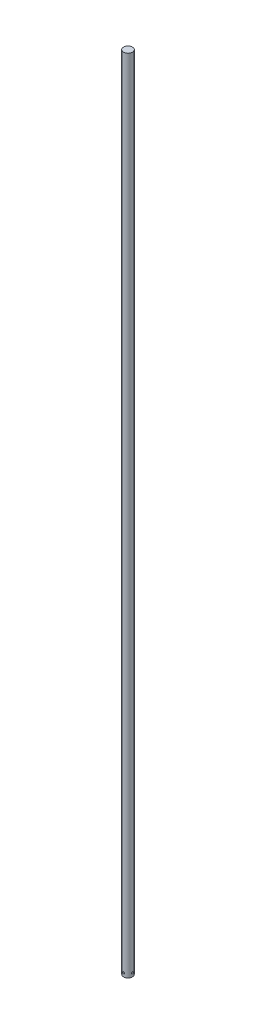
ISO-10303-21;
HEADER;
FILE_DESCRIPTION(('STEP AP214'),'2;1');
FILE_NAME('part.step','',(''),(''),'','','');
FILE_SCHEMA(('AUTOMOTIVE_DESIGN { 1 0 10303 214 1 1 1 1 }'));
ENDSEC;
DATA;
#1=APPLICATION_CONTEXT('core data for automotive mechanical design processes');
#2=APPLICATION_PROTOCOL_DEFINITION('international standard','automotive_design',2000,#1);
#3=PRODUCT_CONTEXT('',#1,'mechanical');
#4=PRODUCT('Part','Part','',(#3));
#5=PRODUCT_RELATED_PRODUCT_CATEGORY('part','',(#4));
#6=PRODUCT_DEFINITION_FORMATION('','',#4);
#7=PRODUCT_DEFINITION_CONTEXT('part definition',#1,'design');
#8=PRODUCT_DEFINITION('design','',#6,#7);
#9=PRODUCT_DEFINITION_SHAPE('','',#8);
#10=(LENGTH_UNIT() NAMED_UNIT(*) SI_UNIT(.MILLI.,.METRE.));
#11=(NAMED_UNIT(*) PLANE_ANGLE_UNIT() SI_UNIT($,.RADIAN.));
#12=(NAMED_UNIT(*) SI_UNIT($,.STERADIAN.) SOLID_ANGLE_UNIT());
#13=UNCERTAINTY_MEASURE_WITH_UNIT(LENGTH_MEASURE(1.E-05),#10,'distance_accuracy_value','');
#14=(GEOMETRIC_REPRESENTATION_CONTEXT(3) GLOBAL_UNCERTAINTY_ASSIGNED_CONTEXT((#13)) GLOBAL_UNIT_ASSIGNED_CONTEXT((#10,
#11,#12)) REPRESENTATION_CONTEXT('',''));
#15=CARTESIAN_POINT('',(0.,0.,0.));
#16=DIRECTION('',(0.,0.,1.));
#17=DIRECTION('',(1.,0.,0.));
#18=AXIS2_PLACEMENT_3D('',#15,#16,#17);
#19=CARTESIAN_POINT('',(0.,900.,0.));
#20=DIRECTION('',(0.,-1.,0.));
#21=DIRECTION('',(0.,0.,-1.));
#22=AXIS2_PLACEMENT_3D('',#19,#20,#21);
#23=CYLINDRICAL_SURFACE('',#22,5.);
#24=CARTESIAN_POINT('',(0.,5.,-5.));
#25=CARTESIAN_POINT('',(-0.055576906792633,4.99999795550166,-4.99999897580871));
#26=CARTESIAN_POINT('',(-0.111179660201522,4.99535115703235,-4.99906385178231));
#27=CARTESIAN_POINT('',(-0.220813507689019,4.97690149988475,-4.99542365623231));
#28=CARTESIAN_POINT('',(-0.274843317541355,4.96309136719849,-4.99271717860186));
#29=CARTESIAN_POINT('',(-0.379730305263311,4.92675872637921,-4.98583649278287));
#30=CARTESIAN_POINT('',(-0.430590467933132,4.9042445631553,-4.98166369076718));
#31=CARTESIAN_POINT('',(-0.527807988864223,4.8511677524887,-4.97230398035314));
#32=CARTESIAN_POINT('',(-0.574165615075808,4.82060558439279,-4.96711713235707));
#33=CARTESIAN_POINT('',(-0.661693477314861,4.75186150570855,-4.9562216532997));
#34=CARTESIAN_POINT('',(-0.702793951158519,4.71359164460879,-4.95050745504348));
#35=CARTESIAN_POINT('',(-0.778036756608022,4.63070758360828,-4.93924180452589));
#36=CARTESIAN_POINT('',(-0.812178544770417,4.58609288866487,-4.93369036500424));
#37=CARTESIAN_POINT('',(-0.872831753347612,4.49128380698811,-4.92332441812615));
#38=CARTESIAN_POINT('',(-0.899270938865857,4.44104235620363,-4.91851707364946));
#39=CARTESIAN_POINT('',(-0.943305666580297,4.3367181809959,-4.91026268058418));
#40=CARTESIAN_POINT('',(-0.960902082437225,4.28263583665364,-4.90681549761962));
#41=CARTESIAN_POINT('',(-0.986525299884813,4.17291563609207,-4.90172805252205));
#42=CARTESIAN_POINT('',(-0.994674497958762,4.11730745585776,-4.90006470107188));
#43=CARTESIAN_POINT('',(-1.0015521277261,4.00549017863564,-4.89866375060628));
#44=CARTESIAN_POINT('',(-1.00028152271348,3.94928114367984,-4.89892595467841));
#45=CARTESIAN_POINT('',(-0.988454573101799,3.83875321197898,-4.90132551148185));
#46=CARTESIAN_POINT('',(-0.978038540243884,3.78441859437267,-4.90343452858764));
#47=CARTESIAN_POINT('',(-0.948437884623028,3.67828392333698,-4.90924546160002));
#48=CARTESIAN_POINT('',(-0.929252843100657,3.62648399108098,-4.91294745357779));
#49=CARTESIAN_POINT('',(-0.882524783674695,3.52648473829639,-4.92155618500409));
#50=CARTESIAN_POINT('',(-0.854926151232088,3.47831212043081,-4.92647089813705));
#51=CARTESIAN_POINT('',(-0.792193574572651,3.38722915002717,-4.93694618773062));
#52=CARTESIAN_POINT('',(-0.7570587643568,3.34431940314883,-4.94250683838366));
#53=CARTESIAN_POINT('',(-0.679499934560554,3.26417059754305,-4.95377021241462));
#54=CARTESIAN_POINT('',(-0.636956161212414,3.22704743214086,-4.95947369210905));
#55=CARTESIAN_POINT('',(-0.546185024061978,3.16044615369877,-4.97028848714409));
#56=CARTESIAN_POINT('',(-0.497957587379357,3.13096813870641,-4.97539979488974));
#57=CARTESIAN_POINT('',(-0.397059386878887,3.08047249077402,-4.98446690160887));
#58=CARTESIAN_POINT('',(-0.344381819585266,3.05946810635546,-4.98842088848272));
#59=CARTESIAN_POINT('',(-0.23614897644863,3.02663952596143,-4.99471408987859));
#60=CARTESIAN_POINT('',(-0.180594050072415,3.01481421792637,-4.99705350000532));
#61=CARTESIAN_POINT('',(-0.0691794056271155,3.00084354620572,-4.99982671866868));
#62=CARTESIAN_POINT('',(-0.0133403283255413,2.99853958045973,-5.0002917465247));
#63=CARTESIAN_POINT('',(0.0979249341927487,3.00324985894218,-4.99935051930103));
#64=CARTESIAN_POINT('',(0.153351142443828,3.0102635793526,-4.99794436941446));
#65=CARTESIAN_POINT('',(0.261705659946574,3.03327837354396,-4.99343832008017));
#66=CARTESIAN_POINT('',(0.314651948339936,3.04919806849791,-4.99035376404206));
#67=CARTESIAN_POINT('',(0.4171236274997,3.08948398265582,-4.98283552061032));
#68=CARTESIAN_POINT('',(0.466648761637572,3.11385083467684,-4.97840173214226));
#69=CARTESIAN_POINT('',(0.561541173686249,3.17068249065132,-4.96859911533294));
#70=CARTESIAN_POINT('',(0.606850126752219,3.20324278103896,-4.96321950437051));
#71=CARTESIAN_POINT('',(0.691418019119237,3.27540919120729,-4.95214734829882));
#72=CARTESIAN_POINT('',(0.730676308930792,3.31501606639988,-4.94645476968387));
#73=CARTESIAN_POINT('',(0.802640590774204,3.40087335189114,-4.93529303556965));
#74=CARTESIAN_POINT('',(0.835237702448682,3.44721574422135,-4.92982860233304));
#75=CARTESIAN_POINT('',(0.892185420051231,3.54481136135669,-4.91984191796194));
#76=CARTESIAN_POINT('',(0.916536355922927,3.59606438957357,-4.91531962913342));
#77=CARTESIAN_POINT('',(0.956151841581983,3.70176824614957,-4.90776740584382));
#78=CARTESIAN_POINT('',(0.971463499791072,3.75620084121034,-4.90472974872186));
#79=CARTESIAN_POINT('',(0.992708651627215,3.86693345349092,-4.90047436792025));
#80=CARTESIAN_POINT('',(0.998643368225131,3.92323322620937,-4.89925640691111));
#81=CARTESIAN_POINT('',(1.00092091086748,4.03500886454434,-4.89879149631379));
#82=CARTESIAN_POINT('',(0.997435788070911,4.09048114892703,-4.89950919189301));
#83=CARTESIAN_POINT('',(0.981352304100074,4.20003164990504,-4.90275573484614));
#84=CARTESIAN_POINT('',(0.968754016129311,4.25410987769482,-4.90528456767169));
#85=CARTESIAN_POINT('',(0.934878568498965,4.35922771124056,-4.91185264219158));
#86=CARTESIAN_POINT('',(0.913622506717355,4.41027436050243,-4.9158882101883));
#87=CARTESIAN_POINT('',(0.863054644601613,4.50810372073445,-4.9250171497417));
#88=CARTESIAN_POINT('',(0.83374216877489,4.55488607372515,-4.93011060998894));
#89=CARTESIAN_POINT('',(0.767305914786421,4.64371557215033,-4.94088960523225));
#90=CARTESIAN_POINT('',(0.730057887235186,4.68566876526761,-4.94658372909699));
#91=CARTESIAN_POINT('',(0.649064369013145,4.76278620552918,-4.95786081871955));
#92=CARTESIAN_POINT('',(0.605317387153339,4.79794889031728,-4.96344375863184));
#93=CARTESIAN_POINT('',(0.512017629088249,4.86083464394646,-4.97393832387971));
#94=CARTESIAN_POINT('',(0.462408884429837,4.88847600328003,-4.97884231219246));
#95=CARTESIAN_POINT('',(0.359166360940734,4.9349861225966,-4.98735125085));
#96=CARTESIAN_POINT('',(0.305536260863127,4.9538627895325,-4.99095737138616));
#97=CARTESIAN_POINT('',(0.20982148892378,4.97865194804472,-4.99576372595371));
#98=CARTESIAN_POINT('',(0.168281664013785,4.98664319370776,-4.99734303158452));
#99=CARTESIAN_POINT('',(0.0844995252100672,4.99731791235837,-4.99946154139893));
#100=CARTESIAN_POINT('',(0.0422572337486191,5.00000155450977,-5.00000077873155));
#101=CARTESIAN_POINT('',(0.,5.,-5.));
#102=B_SPLINE_CURVE_WITH_KNOTS('',3,(#24,#25,#26,#27,#28,#29,#30,#31,#32,#33,#34,#35,#36,#37,
#38,#39,#40,#41,#42,#43,#44,#45,#46,#47,#48,#49,#50,#51,#52,#53,#54,#55,#56,#57,#58,#59,#60,#61,
#62,#63,#64,#65,#66,#67,#68,#69,#70,#71,#72,#73,#74,#75,#76,#77,#78,#79,#80,#81,#82,#83,#84,#85,
#86,#87,#88,#89,#90,#91,#92,#93,#94,#95,#96,#97,#98,#99,#100,#101),.UNSPECIFIED.,.T.,.F.,(4,2,2,
2,2,2,2,2,2,2,2,2,2,2,2,2,2,2,2,2,2,2,2,2,2,2,2,2,2,2,2,2,2,2,2,2,2,2,4),(0.,0.166576130661258,
0.333284650691323,0.499833735250342,0.666372902230863,0.834932670112186,1.00350559674737,
1.17361195005923,1.34370149365197,1.51156185103587,1.67940504281225,1.84471727006278,
2.0100373925373,2.17647490203593,2.3429315474967,2.51238252491351,2.6818356753982,
2.85155274854024,3.02124925698036,3.18810735676265,3.35495607657868,3.52030453950723,
3.68566539216022,3.85305066033359,4.0204538834593,4.19040628579226,4.36035188723466,
4.52940381032723,4.69843368330415,4.86439722567701,5.03035943492608,5.1959196125311,
5.36149367581866,5.52988076239143,5.6983065453293,5.86849496675637,6.03852955517519,
6.16518775289894,6.29184191370996),.UNSPECIFIED.);
#103=CARTESIAN_POINT('',(0.,5.,-5.));
#104=VERTEX_POINT('',#103);
#105=EDGE_CURVE('E91',#104,#104,#102,.T.);
#106=ORIENTED_EDGE('',*,*,#105,.T.);
#107=EDGE_LOOP('',(#106));
#108=FACE_BOUND('',#107,.T.);
#109=CARTESIAN_POINT('',(0.999999999999983,4.,4.89897948556636));
#110=CARTESIAN_POINT('',(0.999997945876028,3.94443562451802,4.89898059043933));
#111=CARTESIAN_POINT('',(0.995353171723639,3.88884537669351,4.89993508346913));
#112=CARTESIAN_POINT('',(0.976912283588318,3.77923749488159,4.90364431385263));
#113=CARTESIAN_POINT('',(0.963108847071164,3.72522115536893,4.90640049166333));
#114=CARTESIAN_POINT('',(0.926795782617721,3.62036269663707,4.91338873700356));
#115=CARTESIAN_POINT('',(0.904294814152065,3.56951747846507,4.91761933615313));
#116=CARTESIAN_POINT('',(0.851249107671026,3.47232515530538,4.92707799486421));
#117=CARTESIAN_POINT('',(0.820704818601279,3.42597779946273,4.93230599875015));
#118=CARTESIAN_POINT('',(0.751979075653272,3.3384389961455,4.9432529969268));
#119=CARTESIAN_POINT('',(0.713705655913262,3.29732041211586,4.94897737836825));
#120=CARTESIAN_POINT('',(0.630806789021332,3.22204246642119,4.9602247230302));
#121=CARTESIAN_POINT('',(0.586180896977978,3.18788359258285,4.96574767210945));
#122=CARTESIAN_POINT('',(0.491361355924228,3.12721198237149,4.97602796417448));
#123=CARTESIAN_POINT('',(0.44112256767219,3.10076848618335,4.9807782144152));
#124=CARTESIAN_POINT('',(0.336804150387257,3.05672506295188,4.98891736883662));
#125=CARTESIAN_POINT('',(0.282724881420536,3.03912430809901,4.99230640044128));
#126=CARTESIAN_POINT('',(0.173016773278476,3.01349280638037,4.99730320688411));
#127=CARTESIAN_POINT('',(0.117417739214797,3.00533902242899,4.99893386288125));
#128=CARTESIAN_POINT('',(0.00561856843751943,2.99844904816169,5.00030921183606));
#129=CARTESIAN_POINT('',(-0.0505815098318601,2.99971195035418,5.0000540865276));
#130=CARTESIAN_POINT('',(-0.161142000743606,3.01152618021555,4.99770434868515));
#131=CARTESIAN_POINT('',(-0.215517214298487,3.02194497716785,4.99563598365838));
#132=CARTESIAN_POINT('',(-0.321731626580318,3.05156503245889,4.98992177159409));
#133=CARTESIAN_POINT('',(-0.373570723747146,3.07076664219187,4.98627586144039));
#134=CARTESIAN_POINT('',(-0.473619463200904,3.11753004014727,4.97777296019958));
#135=CARTESIAN_POINT('',(-0.521804174133917,3.14514375110489,4.97290848175223));
#136=CARTESIAN_POINT('',(-0.612905045859773,3.2079090772366,4.96250469473785));
#137=CARTESIAN_POINT('',(-0.655820599525018,3.24306155977052,4.95696530855222));
#138=CARTESIAN_POINT('',(-0.735951431053474,3.32063362210847,4.94570964364459));
#139=CARTESIAN_POINT('',(-0.773054316573649,3.36316918672959,4.93999196457516));
#140=CARTESIAN_POINT('',(-0.839618493176824,3.45391644245075,4.9291157159876));
#141=CARTESIAN_POINT('',(-0.869079639727768,3.5021282408832,4.92395715704548));
#142=CARTESIAN_POINT('',(-0.919562814801898,3.60302083182181,4.91478047472923));
#143=CARTESIAN_POINT('',(-0.940566647777726,3.65571096763966,4.91076481563549));
#144=CARTESIAN_POINT('',(-0.973390341627599,3.76397132372399,4.90436476321273));
#145=CARTESIAN_POINT('',(-0.985211399456659,3.81954116761908,4.90198015728427));
#146=CARTESIAN_POINT('',(-0.999166006036068,3.93096485799904,4.89915479267827));
#147=CARTESIAN_POINT('',(-1.00146185889793,3.98679757431034,4.89868147057154));
#148=CARTESIAN_POINT('',(-0.996737628310756,4.09804822319968,4.89964485688854));
#149=CARTESIAN_POINT('',(-0.989718073122459,4.15346617911886,4.90108145700388));
#150=CARTESIAN_POINT('',(-0.966702208074174,4.26176864029224,4.90567232494914));
#151=CARTESIAN_POINT('',(-0.950792620839315,4.31467234303576,4.90880999014496));
#152=CARTESIAN_POINT('',(-0.910541035308534,4.41706327902874,4.91643489351665));
#153=CARTESIAN_POINT('',(-0.886198342373194,4.46655023043572,4.92092224286269));
#154=CARTESIAN_POINT('',(-0.829404142215615,4.56141310995016,4.93081405962039));
#155=CARTESIAN_POINT('',(-0.796851077982771,4.60672704630083,4.93622971864903));
#156=CARTESIAN_POINT('',(-0.72469557221273,4.69130831200092,4.94733723826636));
#157=CARTESIAN_POINT('',(-0.685092405144555,4.73057501824925,4.95302912723818));
#158=CARTESIAN_POINT('',(-0.599232273497908,4.80256255918558,4.96415345869215));
#159=CARTESIAN_POINT('',(-0.552882498929647,4.83517365465,4.96958057708684));
#160=CARTESIAN_POINT('',(-0.455267896634773,4.89214588149958,4.9794712762862));
#161=CARTESIAN_POINT('',(-0.404003275433524,4.91650735934478,4.98393489755211));
#162=CARTESIAN_POINT('',(-0.29830268082403,4.95612887174663,4.99137294061067));
#163=CARTESIAN_POINT('',(-0.243886673478095,4.97144051822625,4.99435579142604));
#164=CARTESIAN_POINT('',(-0.13318945467993,4.99269124766385,4.9985323593766));
#165=CARTESIAN_POINT('',(-0.0769084687112314,4.99863145947568,4.99972629199843));
#166=CARTESIAN_POINT('',(0.0348728939036059,5.00092698096289,5.00018540454121));
#167=CARTESIAN_POINT('',(0.0903698121414847,4.99744728045621,4.99948378549351));
#168=CARTESIAN_POINT('',(0.199971031315624,4.98136604945219,4.99630043560318));
#169=CARTESIAN_POINT('',(0.254075349753674,4.96876463365193,4.99381872714351));
#170=CARTESIAN_POINT('',(0.359252749745079,4.93487100790836,4.98735498365001));
#171=CARTESIAN_POINT('',(0.410332443240263,4.91359862186882,4.98337637247913));
#172=CARTESIAN_POINT('',(0.508221220185935,4.8629877586691,4.97434722123383));
#173=CARTESIAN_POINT('',(0.555029965767394,4.83364864409628,4.96929659645878));
#174=CARTESIAN_POINT('',(0.643863890106341,4.76718061293792,4.95857599157869));
#175=CARTESIAN_POINT('',(0.685799716116487,4.72993366361323,4.95289733422143));
#176=CARTESIAN_POINT('',(0.762882617756829,4.64894975990422,4.94161222903623));
#177=CARTESIAN_POINT('',(0.798028083202695,4.60521127053126,4.93600579862875));
#178=CARTESIAN_POINT('',(0.860892219455183,4.51192068329982,4.92543342749964));
#179=CARTESIAN_POINT('',(0.88852681463975,4.46231103883963,4.92047503631328));
#180=CARTESIAN_POINT('',(0.935024049287791,4.35906722670031,4.91185237184445));
#181=CARTESIAN_POINT('',(0.953894645979273,4.30543676130208,4.90818692536957));
#182=CARTESIAN_POINT('',(0.978669139854256,4.20973754456343,4.90329681128922));
#183=CARTESIAN_POINT('',(0.986653898522969,4.16821458048854,4.90168784915661));
#184=CARTESIAN_POINT('',(0.997320017960392,4.08446604544636,4.8995287845803));
#185=CARTESIAN_POINT('',(1.00000156156204,4.04224049875183,4.89897864563277));
#186=CARTESIAN_POINT('',(0.999999999999983,4.,4.89897948556636));
#187=B_SPLINE_CURVE_WITH_KNOTS('',3,(#109,#110,#111,#112,#113,#114,#115,#116,#117,#118,#119,
#120,#121,#122,#123,#124,#125,#126,#127,#128,#129,#130,#131,#132,#133,#134,#135,#136,#137,#138,
#139,#140,#141,#142,#143,#144,#145,#146,#147,#148,#149,#150,#151,#152,#153,#154,#155,#156,#157,
#158,#159,#160,#161,#162,#163,#164,#165,#166,#167,#168,#169,#170,#171,#172,#173,#174,#175,#176,
#177,#178,#179,#180,#181,#182,#183,#184,#185,#186),.UNSPECIFIED.,.T.,.F.,(4,2,2,2,2,2,2,2,2,2,2,
2,2,2,2,2,2,2,2,2,2,2,2,2,2,2,2,2,2,2,2,2,2,2,2,2,2,2,4),(0.,0.166538463856524,
0.333210239259264,0.499716497915554,0.666213464834831,0.834822525459335,1.00344340032919,
1.17353400434947,1.34360868244057,1.51144248880577,1.67926012113745,1.84468789631034,
2.01012229071247,2.176599242198,2.34309535767563,2.5124934675998,2.68189478120217,
2.85165863170273,3.02140035013522,3.1882375780209,3.35506534525918,3.52029341780816,
3.68553510351895,3.85293059772018,4.02034332867706,4.19032601730948,4.36030156627602,
4.52929813576147,4.69827434689125,4.86431017412183,5.03034391364254,5.19600017072949,
5.36166952132181,5.53001152023094,5.69839338887278,5.86858898576538,6.0386297508643,
6.16523803634393,6.29184195681712),.UNSPECIFIED.);
#188=CARTESIAN_POINT('',(0.999999999999983,4.,4.89897948556636));
#189=VERTEX_POINT('',#188);
#190=EDGE_CURVE('E87',#189,#189,#187,.T.);
#191=ORIENTED_EDGE('',*,*,#190,.T.);
#192=EDGE_LOOP('',(#191));
#193=FACE_BOUND('',#192,.T.);
#194=CARTESIAN_POINT('',(4.89897948556636,4.,1.));
#195=CARTESIAN_POINT('',(4.89898059043933,4.05556437548198,0.999997945876045));
#196=CARTESIAN_POINT('',(4.89993508346913,4.11115462330649,0.995353171723656));
#197=CARTESIAN_POINT('',(4.90364431385263,4.22076250511841,0.976912283588335));
#198=CARTESIAN_POINT('',(4.90640049166333,4.27477884463107,0.963108847071181));
#199=CARTESIAN_POINT('',(4.91338873700356,4.37963730336293,0.926795782617738));
#200=CARTESIAN_POINT('',(4.91761933615313,4.43048252153493,0.904294814152083));
#201=CARTESIAN_POINT('',(4.92707799486421,4.52767484469462,0.851249107671043));
#202=CARTESIAN_POINT('',(4.93230599875014,4.57402220053727,0.820704818601296));
#203=CARTESIAN_POINT('',(4.9432529969268,4.6615610038545,0.75197907565329));
#204=CARTESIAN_POINT('',(4.94897737836825,4.70267958788414,0.713705655913279));
#205=CARTESIAN_POINT('',(4.9602247230302,4.77795753357881,0.63080678902135));
#206=CARTESIAN_POINT('',(4.96574767210945,4.81211640741714,0.586180896977995));
#207=CARTESIAN_POINT('',(4.97602796417448,4.8727880176285,0.491361355924246));
#208=CARTESIAN_POINT('',(4.9807782144152,4.89923151381665,0.441122567672208));
#209=CARTESIAN_POINT('',(4.98891736883662,4.94327493704812,0.336804150387275));
#210=CARTESIAN_POINT('',(4.99230640044127,4.96087569190099,0.282724881420554));
#211=CARTESIAN_POINT('',(4.9973032068841,4.98650719361963,0.173016773278494));
#212=CARTESIAN_POINT('',(4.99893386288125,4.99466097757101,0.117417739214814));
#213=CARTESIAN_POINT('',(5.00030921183606,5.00155095183831,0.0056185684375371));
#214=CARTESIAN_POINT('',(5.0000540865276,5.00028804964582,-0.0505815098318425));
#215=CARTESIAN_POINT('',(4.99770434868515,4.98847381978445,-0.161142000743588));
#216=CARTESIAN_POINT('',(4.99563598365838,4.97805502283215,-0.21551721429847));
#217=CARTESIAN_POINT('',(4.98992177159409,4.94843496754111,-0.321731626580301));
#218=CARTESIAN_POINT('',(4.98627586144039,4.92923335780813,-0.373570723747128));
#219=CARTESIAN_POINT('',(4.97777296019958,4.88246995985273,-0.473619463200887));
#220=CARTESIAN_POINT('',(4.97290848175224,4.85485624889511,-0.521804174133899));
#221=CARTESIAN_POINT('',(4.96250469473785,4.7920909227634,-0.612905045859755));
#222=CARTESIAN_POINT('',(4.95696530855222,4.75693844022948,-0.655820599525));
#223=CARTESIAN_POINT('',(4.9457096436446,4.67936637789153,-0.735951431053457));
#224=CARTESIAN_POINT('',(4.93999196457516,4.63683081327041,-0.773054316573631));
#225=CARTESIAN_POINT('',(4.92911571598761,4.54608355754925,-0.839618493176807));
#226=CARTESIAN_POINT('',(4.92395715704548,4.4978717591168,-0.86907963972775));
#227=CARTESIAN_POINT('',(4.91478047472924,4.39697916817819,-0.919562814801881));
#228=CARTESIAN_POINT('',(4.91076481563549,4.34428903236034,-0.940566647777709));
#229=CARTESIAN_POINT('',(4.90436476321273,4.23602867627601,-0.973390341627582));
#230=CARTESIAN_POINT('',(4.90198015728428,4.18045883238092,-0.985211399456642));
#231=CARTESIAN_POINT('',(4.89915479267828,4.06903514200095,-0.999166006036051));
#232=CARTESIAN_POINT('',(4.89868147057154,4.01320242568966,-1.00146185889791));
#233=CARTESIAN_POINT('',(4.89964485688854,3.90195177680032,-0.996737628310738));
#234=CARTESIAN_POINT('',(4.90108145700388,3.84653382088114,-0.989718073122442));
#235=CARTESIAN_POINT('',(4.90567232494915,3.73823135970777,-0.966702208074157));
#236=CARTESIAN_POINT('',(4.90880999014497,3.68532765696424,-0.950792620839298));
#237=CARTESIAN_POINT('',(4.91643489351665,3.58293672097126,-0.910541035308518));
#238=CARTESIAN_POINT('',(4.9209222428627,3.53344976956428,-0.886198342373177));
#239=CARTESIAN_POINT('',(4.93081405962039,3.43858689004984,-0.829404142215598));
#240=CARTESIAN_POINT('',(4.93622971864903,3.39327295369917,-0.796851077982754));
#241=CARTESIAN_POINT('',(4.94733723826637,3.30869168799909,-0.724695572212713));
#242=CARTESIAN_POINT('',(4.95302912723818,3.26942498175075,-0.685092405144538));
#243=CARTESIAN_POINT('',(4.96415345869216,3.19743744081442,-0.599232273497891));
#244=CARTESIAN_POINT('',(4.96958057708684,3.16482634535,-0.55288249892963));
#245=CARTESIAN_POINT('',(4.9794712762862,3.10785411850042,-0.455267896634756));
#246=CARTESIAN_POINT('',(4.98393489755211,3.08349264065522,-0.404003275433507));
#247=CARTESIAN_POINT('',(4.99137294061067,3.04387112825337,-0.298302680824013));
#248=CARTESIAN_POINT('',(4.99435579142604,3.02855948177375,-0.243886673478078));
#249=CARTESIAN_POINT('',(4.9985323593766,3.00730875233615,-0.133189454679913));
#250=CARTESIAN_POINT('',(4.99972629199843,3.00136854052432,-0.0769084687112144));
#251=CARTESIAN_POINT('',(5.00018540454121,2.99907301903711,0.0348728939036229));
#252=CARTESIAN_POINT('',(4.99948378549351,3.00255271954379,0.090369812141502));
#253=CARTESIAN_POINT('',(4.99630043560318,3.01863395054781,0.199971031315641));
#254=CARTESIAN_POINT('',(4.99381872714351,3.03123536634807,0.254075349753691));
#255=CARTESIAN_POINT('',(4.98735498365001,3.06512899209164,0.359252749745096));
#256=CARTESIAN_POINT('',(4.98337637247912,3.08640137813118,0.41033244324028));
#257=CARTESIAN_POINT('',(4.97434722123382,3.1370122413309,0.508221220185952));
#258=CARTESIAN_POINT('',(4.96929659645878,3.16635135590372,0.555029965767411));
#259=CARTESIAN_POINT('',(4.95857599157869,3.23281938706208,0.643863890106357));
#260=CARTESIAN_POINT('',(4.95289733422142,3.27006633638677,0.685799716116503));
#261=CARTESIAN_POINT('',(4.94161222903622,3.35105024009577,0.762882617756845));
#262=CARTESIAN_POINT('',(4.93600579862875,3.39478872946874,0.798028083202712));
#263=CARTESIAN_POINT('',(4.92543342749964,3.48807931670018,0.8608922194552));
#264=CARTESIAN_POINT('',(4.92047503631328,3.53768896116036,0.888526814639766));
#265=CARTESIAN_POINT('',(4.91185237184445,3.64093277329969,0.935024049287808));
#266=CARTESIAN_POINT('',(4.90818692536957,3.69456323869792,0.95389464597929));
#267=CARTESIAN_POINT('',(4.90329681128922,3.79026245543657,0.978669139854273));
#268=CARTESIAN_POINT('',(4.90168784915661,3.83178541951145,0.986653898522985));
#269=CARTESIAN_POINT('',(4.8995287845803,3.91553395455364,0.997320017960409));
#270=CARTESIAN_POINT('',(4.89897864563277,3.95775950124817,1.00000156156205));
#271=CARTESIAN_POINT('',(4.89897948556636,4.,1.));
#272=B_SPLINE_CURVE_WITH_KNOTS('',3,(#194,#195,#196,#197,#198,#199,#200,#201,#202,#203,#204,
#205,#206,#207,#208,#209,#210,#211,#212,#213,#214,#215,#216,#217,#218,#219,#220,#221,#222,#223,
#224,#225,#226,#227,#228,#229,#230,#231,#232,#233,#234,#235,#236,#237,#238,#239,#240,#241,#242,
#243,#244,#245,#246,#247,#248,#249,#250,#251,#252,#253,#254,#255,#256,#257,#258,#259,#260,#261,
#262,#263,#264,#265,#266,#267,#268,#269,#270,#271),.UNSPECIFIED.,.T.,.F.,(4,2,2,2,2,2,2,2,2,2,2,
2,2,2,2,2,2,2,2,2,2,2,2,2,2,2,2,2,2,2,2,2,2,2,2,2,2,2,4),(0.,0.166538463856524,
0.333210239259264,0.499716497915553,0.666213464834831,0.834822525459334,1.00344340032919,
1.17353400434947,1.34360868244056,1.51144248880577,1.67926012113745,1.84468789631034,
2.01012229071247,2.176599242198,2.34309535767563,2.5124934675998,2.68189478120217,
2.85165863170273,3.02140035013522,3.1882375780209,3.35506534525918,3.52029341780816,
3.68553510351895,3.85293059772018,4.02034332867705,4.19032601730947,4.36030156627601,
4.52929813576147,4.69827434689125,4.86431017412183,5.03034391364253,5.19600017072949,
5.36166952132181,5.53001152023093,5.69839338887278,5.86858898576538,6.03862975086429,
6.16523803634392,6.29184195681711),.UNSPECIFIED.);
#273=CARTESIAN_POINT('',(4.89897948556636,4.,1.));
#274=VERTEX_POINT('',#273);
#275=EDGE_CURVE('E73',#274,#274,#272,.T.);
#276=ORIENTED_EDGE('',*,*,#275,.T.);
#277=EDGE_LOOP('',(#276));
#278=FACE_BOUND('',#277,.T.);
#279=CARTESIAN_POINT('',(-4.89897948556636,4.,-1.));
#280=CARTESIAN_POINT('',(-4.89898059043933,4.05556437548198,-0.999997945876045));
#281=CARTESIAN_POINT('',(-4.89993508346913,4.11115462330649,-0.995353171723656));
#282=CARTESIAN_POINT('',(-4.90364431385263,4.22076250511841,-0.976912283588335));
#283=CARTESIAN_POINT('',(-4.90640049166333,4.27477884463107,-0.963108847071181));
#284=CARTESIAN_POINT('',(-4.91338873700356,4.37963730336293,-0.926795782617738));
#285=CARTESIAN_POINT('',(-4.91761933615313,4.43048252153493,-0.904294814152083));
#286=CARTESIAN_POINT('',(-4.92707799486421,4.52767484469462,-0.851249107671043));
#287=CARTESIAN_POINT('',(-4.93230599875014,4.57402220053727,-0.820704818601296));
#288=CARTESIAN_POINT('',(-4.9432529969268,4.6615610038545,-0.75197907565329));
#289=CARTESIAN_POINT('',(-4.94897737836825,4.70267958788414,-0.713705655913279));
#290=CARTESIAN_POINT('',(-4.9602247230302,4.77795753357881,-0.63080678902135));
#291=CARTESIAN_POINT('',(-4.96574767210945,4.81211640741714,-0.586180896977995));
#292=CARTESIAN_POINT('',(-4.97602796417448,4.8727880176285,-0.491361355924246));
#293=CARTESIAN_POINT('',(-4.9807782144152,4.89923151381665,-0.441122567672208));
#294=CARTESIAN_POINT('',(-4.98891736883662,4.94327493704812,-0.336804150387275));
#295=CARTESIAN_POINT('',(-4.99230640044127,4.96087569190099,-0.282724881420554));
#296=CARTESIAN_POINT('',(-4.9973032068841,4.98650719361963,-0.173016773278494));
#297=CARTESIAN_POINT('',(-4.99893386288125,4.99466097757101,-0.117417739214814));
#298=CARTESIAN_POINT('',(-5.00030921183606,5.00155095183831,-0.0056185684375371));
#299=CARTESIAN_POINT('',(-5.0000540865276,5.00028804964582,0.0505815098318425));
#300=CARTESIAN_POINT('',(-4.99770434868515,4.98847381978445,0.161142000743588));
#301=CARTESIAN_POINT('',(-4.99563598365838,4.97805502283215,0.21551721429847));
#302=CARTESIAN_POINT('',(-4.98992177159409,4.94843496754111,0.321731626580301));
#303=CARTESIAN_POINT('',(-4.98627586144039,4.92923335780813,0.373570723747128));
#304=CARTESIAN_POINT('',(-4.97777296019958,4.88246995985273,0.473619463200887));
#305=CARTESIAN_POINT('',(-4.97290848175224,4.85485624889511,0.521804174133899));
#306=CARTESIAN_POINT('',(-4.96250469473785,4.7920909227634,0.612905045859755));
#307=CARTESIAN_POINT('',(-4.95696530855222,4.75693844022948,0.655820599525));
#308=CARTESIAN_POINT('',(-4.9457096436446,4.67936637789153,0.735951431053457));
#309=CARTESIAN_POINT('',(-4.93999196457516,4.63683081327041,0.773054316573631));
#310=CARTESIAN_POINT('',(-4.92911571598761,4.54608355754925,0.839618493176807));
#311=CARTESIAN_POINT('',(-4.92395715704548,4.4978717591168,0.86907963972775));
#312=CARTESIAN_POINT('',(-4.91478047472924,4.39697916817819,0.919562814801881));
#313=CARTESIAN_POINT('',(-4.91076481563549,4.34428903236034,0.940566647777709));
#314=CARTESIAN_POINT('',(-4.90436476321273,4.23602867627601,0.973390341627582));
#315=CARTESIAN_POINT('',(-4.90198015728428,4.18045883238092,0.985211399456642));
#316=CARTESIAN_POINT('',(-4.89915479267828,4.06903514200095,0.999166006036051));
#317=CARTESIAN_POINT('',(-4.89868147057154,4.01320242568966,1.00146185889791));
#318=CARTESIAN_POINT('',(-4.89964485688854,3.90195177680032,0.996737628310738));
#319=CARTESIAN_POINT('',(-4.90108145700388,3.84653382088114,0.989718073122442));
#320=CARTESIAN_POINT('',(-4.90567232494915,3.73823135970777,0.966702208074157));
#321=CARTESIAN_POINT('',(-4.90880999014497,3.68532765696424,0.950792620839298));
#322=CARTESIAN_POINT('',(-4.91643489351665,3.58293672097126,0.910541035308518));
#323=CARTESIAN_POINT('',(-4.9209222428627,3.53344976956428,0.886198342373177));
#324=CARTESIAN_POINT('',(-4.93081405962039,3.43858689004984,0.829404142215598));
#325=CARTESIAN_POINT('',(-4.93622971864903,3.39327295369917,0.796851077982754));
#326=CARTESIAN_POINT('',(-4.94733723826637,3.30869168799909,0.724695572212713));
#327=CARTESIAN_POINT('',(-4.95302912723818,3.26942498175075,0.685092405144538));
#328=CARTESIAN_POINT('',(-4.96415345869216,3.19743744081442,0.599232273497891));
#329=CARTESIAN_POINT('',(-4.96958057708684,3.16482634535,0.55288249892963));
#330=CARTESIAN_POINT('',(-4.9794712762862,3.10785411850042,0.455267896634756));
#331=CARTESIAN_POINT('',(-4.98393489755211,3.08349264065522,0.404003275433507));
#332=CARTESIAN_POINT('',(-4.99137294061067,3.04387112825337,0.298302680824013));
#333=CARTESIAN_POINT('',(-4.99435579142604,3.02855948177375,0.243886673478078));
#334=CARTESIAN_POINT('',(-4.9985323593766,3.00730875233615,0.133189454679913));
#335=CARTESIAN_POINT('',(-4.99972629199843,3.00136854052432,0.0769084687112144));
#336=CARTESIAN_POINT('',(-5.00018540454121,2.99907301903711,-0.0348728939036229));
#337=CARTESIAN_POINT('',(-4.99948378549351,3.00255271954379,-0.090369812141502));
#338=CARTESIAN_POINT('',(-4.99630043560318,3.01863395054781,-0.199971031315641));
#339=CARTESIAN_POINT('',(-4.99381872714351,3.03123536634807,-0.254075349753691));
#340=CARTESIAN_POINT('',(-4.98735498365001,3.06512899209164,-0.359252749745096));
#341=CARTESIAN_POINT('',(-4.98337637247912,3.08640137813118,-0.41033244324028));
#342=CARTESIAN_POINT('',(-4.97434722123382,3.1370122413309,-0.508221220185952));
#343=CARTESIAN_POINT('',(-4.96929659645878,3.16635135590372,-0.555029965767411));
#344=CARTESIAN_POINT('',(-4.95857599157869,3.23281938706208,-0.643863890106357));
#345=CARTESIAN_POINT('',(-4.95289733422142,3.27006633638677,-0.685799716116503));
#346=CARTESIAN_POINT('',(-4.94161222903622,3.35105024009577,-0.762882617756845));
#347=CARTESIAN_POINT('',(-4.93600579862875,3.39478872946874,-0.798028083202712));
#348=CARTESIAN_POINT('',(-4.92543342749964,3.48807931670018,-0.8608922194552));
#349=CARTESIAN_POINT('',(-4.92047503631328,3.53768896116036,-0.888526814639766));
#350=CARTESIAN_POINT('',(-4.91185237184445,3.64093277329969,-0.935024049287808));
#351=CARTESIAN_POINT('',(-4.90818692536957,3.69456323869792,-0.95389464597929));
#352=CARTESIAN_POINT('',(-4.90329681128922,3.79026245543657,-0.978669139854273));
#353=CARTESIAN_POINT('',(-4.90168784915661,3.83178541951145,-0.986653898522985));
#354=CARTESIAN_POINT('',(-4.8995287845803,3.91553395455364,-0.997320017960409));
#355=CARTESIAN_POINT('',(-4.89897864563277,3.95775950124817,-1.00000156156205));
#356=CARTESIAN_POINT('',(-4.89897948556636,4.,-1.));
#357=B_SPLINE_CURVE_WITH_KNOTS('',3,(#279,#280,#281,#282,#283,#284,#285,#286,#287,#288,#289,
#290,#291,#292,#293,#294,#295,#296,#297,#298,#299,#300,#301,#302,#303,#304,#305,#306,#307,#308,
#309,#310,#311,#312,#313,#314,#315,#316,#317,#318,#319,#320,#321,#322,#323,#324,#325,#326,#327,
#328,#329,#330,#331,#332,#333,#334,#335,#336,#337,#338,#339,#340,#341,#342,#343,#344,#345,#346,
#347,#348,#349,#350,#351,#352,#353,#354,#355,#356),.UNSPECIFIED.,.T.,.F.,(4,2,2,2,2,2,2,2,2,2,2,
2,2,2,2,2,2,2,2,2,2,2,2,2,2,2,2,2,2,2,2,2,2,2,2,2,2,2,4),(0.,0.166538463856524,
0.333210239259264,0.499716497915553,0.666213464834831,0.834822525459334,1.00344340032919,
1.17353400434947,1.34360868244056,1.51144248880577,1.67926012113745,1.84468789631034,
2.01012229071247,2.176599242198,2.34309535767563,2.5124934675998,2.68189478120217,
2.85165863170273,3.02140035013522,3.1882375780209,3.35506534525918,3.52029341780816,
3.68553510351895,3.85293059772018,4.02034332867705,4.19032601730947,4.36030156627601,
4.52929813576147,4.69827434689125,4.86431017412183,5.03034391364253,5.19600017072949,
5.36166952132181,5.53001152023093,5.69839338887278,5.86858898576538,6.03862975086429,
6.16523803634392,6.29184195681711),.UNSPECIFIED.);
#358=CARTESIAN_POINT('',(-4.89897948556636,4.,-1.));
#359=VERTEX_POINT('',#358);
#360=EDGE_CURVE('E42',#359,#359,#357,.T.);
#361=ORIENTED_EDGE('',*,*,#360,.T.);
#362=EDGE_LOOP('',(#361));
#363=FACE_BOUND('',#362,.T.);
#364=CARTESIAN_POINT('',(0.,900.,0.));
#365=DIRECTION('',(0.,1.,0.));
#366=DIRECTION('',(0.,0.,1.));
#367=AXIS2_PLACEMENT_3D('',#364,#365,#366);
#368=CIRCLE('',#367,5.);
#369=CARTESIAN_POINT('',(0.,900.,5.));
#370=VERTEX_POINT('',#369);
#371=EDGE_CURVE('E11',#370,#370,#368,.T.);
#372=ORIENTED_EDGE('',*,*,#371,.F.);
#373=EDGE_LOOP('',(#372));
#374=FACE_BOUND('',#373,.T.);
#375=CARTESIAN_POINT('',(0.,0.,0.));
#376=DIRECTION('',(0.,1.,0.));
#377=DIRECTION('',(0.,0.,1.));
#378=AXIS2_PLACEMENT_3D('',#375,#376,#377);
#379=CIRCLE('',#378,5.);
#380=CARTESIAN_POINT('',(0.,0.,5.));
#381=VERTEX_POINT('',#380);
#382=EDGE_CURVE('E52',#381,#381,#379,.T.);
#383=ORIENTED_EDGE('',*,*,#382,.T.);
#384=EDGE_LOOP('',(#383));
#385=FACE_BOUND('',#384,.T.);
#386=ADVANCED_FACE('F38',(#108,#193,#278,#363,#374,#385),#23,.T.);
#387=CARTESIAN_POINT('',(0.,900.,0.));
#388=DIRECTION('',(0.,1.,0.));
#389=DIRECTION('',(0.,0.,1.));
#390=AXIS2_PLACEMENT_3D('',#387,#388,#389);
#391=PLANE('',#390);
#392=ORIENTED_EDGE('',*,*,#371,.T.);
#393=EDGE_LOOP('',(#392));
#394=FACE_BOUND('',#393,.T.);
#395=ADVANCED_FACE('F111',(#394),#391,.T.);
#396=CARTESIAN_POINT('',(0.,0.,0.));
#397=DIRECTION('',(0.,1.,0.));
#398=DIRECTION('',(0.,0.,1.));
#399=AXIS2_PLACEMENT_3D('',#396,#397,#398);
#400=PLANE('',#399);
#401=ORIENTED_EDGE('',*,*,#382,.F.);
#402=EDGE_LOOP('',(#401));
#403=FACE_BOUND('',#402,.T.);
#404=ADVANCED_FACE('F110',(#403),#400,.F.);
#405=CARTESIAN_POINT('',(-900.,4.,0.));
#406=DIRECTION('',(1.,0.,0.));
#407=DIRECTION('',(0.,0.,-1.));
#408=AXIS2_PLACEMENT_3D('',#405,#406,#407);
#409=CYLINDRICAL_SURFACE('',#408,1.);
#410=CARTESIAN_POINT('',(0.,4.,0.));
#411=DIRECTION('',(0.707106781186549,0.,-0.707106781186546));
#412=DIRECTION('',(0.707106781186546,0.,0.707106781186549));
#413=AXIS2_PLACEMENT_3D('',#410,#411,#412);
#414=ELLIPSE('',#413,1.41421356237309,1.);
#415=CARTESIAN_POINT('',(0.,3.,0.));
#416=VERTEX_POINT('',#415);
#417=CARTESIAN_POINT('',(0.,5.,0.));
#418=VERTEX_POINT('',#417);
#419=EDGE_CURVE('E64',#416,#418,#414,.T.);
#420=ORIENTED_EDGE('',*,*,#419,.T.);
#421=CARTESIAN_POINT('',(0.,4.,0.));
#422=DIRECTION('',(0.707106781186546,0.,0.707106781186549));
#423=DIRECTION('',(0.707106781186549,0.,-0.707106781186546));
#424=AXIS2_PLACEMENT_3D('',#421,#422,#423);
#425=ELLIPSE('',#424,1.4142135623731,1.);
#426=EDGE_CURVE('E72',#418,#416,#425,.T.);
#427=ORIENTED_EDGE('',*,*,#426,.T.);
#428=EDGE_LOOP('',(#420,#427));
#429=FACE_BOUND('',#428,.T.);
#430=ORIENTED_EDGE('',*,*,#360,.F.);
#431=EDGE_LOOP('',(#430));
#432=FACE_BOUND('',#431,.T.);
#433=ADVANCED_FACE('F84',(#429,#432),#409,.F.);
#434=CARTESIAN_POINT('',(3.14233320495882E-12,4.,-900.));
#435=DIRECTION('',(0.,0.,1.));
#436=DIRECTION('',(1.,0.,0.));
#437=AXIS2_PLACEMENT_3D('',#434,#435,#436);
#438=CYLINDRICAL_SURFACE('',#437,1.);
#439=CARTESIAN_POINT('',(0.,4.,0.));
#440=DIRECTION('',(0.707106781186546,0.,0.707106781186549));
#441=DIRECTION('',(-0.707106781186549,0.,0.707106781186546));
#442=AXIS2_PLACEMENT_3D('',#439,#440,#441);
#443=ELLIPSE('',#442,1.4142135623731,1.);
#444=EDGE_CURVE('E67',#416,#418,#443,.T.);
#445=ORIENTED_EDGE('',*,*,#444,.T.);
#446=ORIENTED_EDGE('',*,*,#419,.F.);
#447=EDGE_LOOP('',(#445,#446));
#448=FACE_BOUND('',#447,.T.);
#449=ORIENTED_EDGE('',*,*,#105,.F.);
#450=EDGE_LOOP('',(#449));
#451=FACE_BOUND('',#450,.T.);
#452=ADVANCED_FACE('F65',(#448,#451),#438,.F.);
#453=CARTESIAN_POINT('',(0.,4.,0.));
#454=DIRECTION('',(-0.707106781186551,0.,0.707106781186544));
#455=DIRECTION('',(-0.707106781186544,0.,-0.707106781186551));
#456=AXIS2_PLACEMENT_3D('',#453,#454,#455);
#457=ELLIPSE('',#456,1.41421356237309,1.);
#458=EDGE_CURVE('E59',#416,#418,#457,.T.);
#459=ORIENTED_EDGE('',*,*,#458,.F.);
#460=ORIENTED_EDGE('',*,*,#426,.F.);
#461=EDGE_LOOP('',(#459,#460));
#462=FACE_BOUND('',#461,.T.);
#463=ORIENTED_EDGE('',*,*,#190,.F.);
#464=EDGE_LOOP('',(#463));
#465=FACE_BOUND('',#464,.T.);
#466=ADVANCED_FACE('F80',(#462,#465),#438,.F.);
#467=CARTESIAN_POINT('',(900.,4.,0.));
#468=DIRECTION('',(-1.,0.,0.));
#469=DIRECTION('',(0.,0.,1.));
#470=AXIS2_PLACEMENT_3D('',#467,#468,#469);
#471=CYLINDRICAL_SURFACE('',#470,1.);
#472=ORIENTED_EDGE('',*,*,#458,.T.);
#473=ORIENTED_EDGE('',*,*,#444,.F.);
#474=EDGE_LOOP('',(#472,#473));
#475=FACE_BOUND('',#474,.T.);
#476=ORIENTED_EDGE('',*,*,#275,.F.);
#477=EDGE_LOOP('',(#476));
#478=FACE_BOUND('',#477,.T.);
#479=ADVANCED_FACE('F75',(#475,#478),#471,.F.);
#480=CLOSED_SHELL('',(#386,#395,#404,#433,#452,#466,#479));
#481=MANIFOLD_SOLID_BREP('B2',#480);
#482=ADVANCED_BREP_SHAPE_REPRESENTATION('',(#18,#481),#14);
#483=SHAPE_DEFINITION_REPRESENTATION(#9,#482);
ENDSEC;
END-ISO-10303-21;
